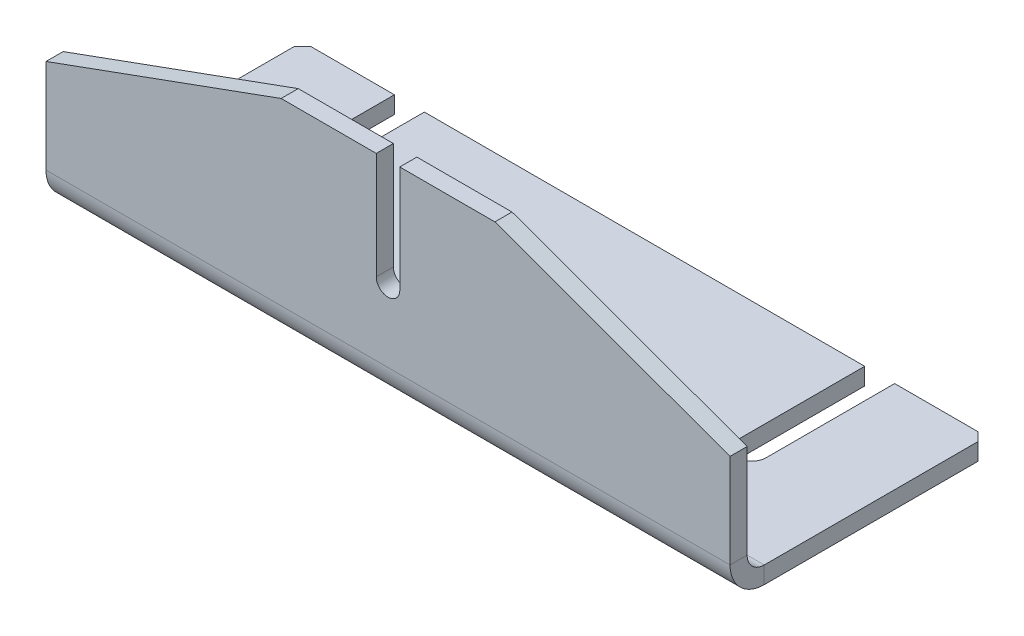
ISO-10303-21;
HEADER;
FILE_DESCRIPTION(('STEP AP214'),'2;1');
FILE_NAME('part.step','',(''),(''),'','','');
FILE_SCHEMA(('AUTOMOTIVE_DESIGN { 1 0 10303 214 1 1 1 1 }'));
ENDSEC;
DATA;
#1=APPLICATION_CONTEXT('core data for automotive mechanical design processes');
#2=APPLICATION_PROTOCOL_DEFINITION('international standard','automotive_design',2000,#1);
#3=PRODUCT_CONTEXT('',#1,'mechanical');
#4=PRODUCT('Part','Part','',(#3));
#5=PRODUCT_RELATED_PRODUCT_CATEGORY('part','',(#4));
#6=PRODUCT_DEFINITION_FORMATION('','',#4);
#7=PRODUCT_DEFINITION_CONTEXT('part definition',#1,'design');
#8=PRODUCT_DEFINITION('design','',#6,#7);
#9=PRODUCT_DEFINITION_SHAPE('','',#8);
#10=(LENGTH_UNIT() NAMED_UNIT(*) SI_UNIT(.MILLI.,.METRE.));
#11=(NAMED_UNIT(*) PLANE_ANGLE_UNIT() SI_UNIT($,.RADIAN.));
#12=(NAMED_UNIT(*) SI_UNIT($,.STERADIAN.) SOLID_ANGLE_UNIT());
#13=UNCERTAINTY_MEASURE_WITH_UNIT(LENGTH_MEASURE(1.E-05),#10,'distance_accuracy_value','');
#14=(GEOMETRIC_REPRESENTATION_CONTEXT(3) GLOBAL_UNCERTAINTY_ASSIGNED_CONTEXT((#13)) GLOBAL_UNIT_ASSIGNED_CONTEXT((#10,
#11,#12)) REPRESENTATION_CONTEXT('',''));
#15=CARTESIAN_POINT('',(0.,0.,0.));
#16=DIRECTION('',(0.,0.,1.));
#17=DIRECTION('',(1.,0.,0.));
#18=AXIS2_PLACEMENT_3D('',#15,#16,#17);
#19=CARTESIAN_POINT('',(80.,0.,0.));
#20=DIRECTION('',(0.,1.,0.));
#21=DIRECTION('',(0.,0.,1.));
#22=AXIS2_PLACEMENT_3D('',#19,#20,#21);
#23=PLANE('',#22);
#24=DIRECTION('',(0.,0.,-1.));
#25=VECTOR('',#24,1.);
#26=CARTESIAN_POINT('',(-80.,0.,0.));
#27=LINE('',#26,#25);
#28=CARTESIAN_POINT('',(-80.,0.,-8.));
#29=VERTEX_POINT('',#28);
#30=CARTESIAN_POINT('',(-80.,0.,-58.));
#31=VERTEX_POINT('',#30);
#32=EDGE_CURVE('E336',#29,#31,#27,.T.);
#33=ORIENTED_EDGE('',*,*,#32,.T.);
#34=DIRECTION('',(-0.707106781186548,0.,0.707106781186548));
#35=VECTOR('',#34,1.);
#36=CARTESIAN_POINT('',(-80.,0.,-58.));
#37=LINE('',#36,#35);
#38=CARTESIAN_POINT('',(-78.,0.,-60.));
#39=VERTEX_POINT('',#38);
#40=EDGE_CURVE('E422',#31,#39,#37,.F.);
#41=ORIENTED_EDGE('',*,*,#40,.T.);
#42=DIRECTION('',(-1.,0.,0.));
#43=VECTOR('',#42,1.);
#44=CARTESIAN_POINT('',(80.,0.,-60.));
#45=LINE('',#44,#43);
#46=CARTESIAN_POINT('',(-58.5,0.,-60.));
#47=VERTEX_POINT('',#46);
#48=EDGE_CURVE('E394',#47,#39,#45,.T.);
#49=ORIENTED_EDGE('',*,*,#48,.F.);
#50=DIRECTION('',(0.,0.,1.));
#51=VECTOR('',#50,1.);
#52=CARTESIAN_POINT('',(-58.5,0.,-90.));
#53=LINE('',#52,#51);
#54=CARTESIAN_POINT('',(-58.5,0.,-30.));
#55=VERTEX_POINT('',#54);
#56=EDGE_CURVE('E272',#47,#55,#53,.T.);
#57=ORIENTED_EDGE('',*,*,#56,.T.);
#58=CARTESIAN_POINT('',(-55.,0.,-30.));
#59=DIRECTION('',(0.,1.,0.));
#60=DIRECTION('',(0.,0.,1.));
#61=AXIS2_PLACEMENT_3D('',#58,#59,#60);
#62=CIRCLE('',#61,3.5);
#63=CARTESIAN_POINT('',(-51.5,0.,-30.));
#64=VERTEX_POINT('',#63);
#65=EDGE_CURVE('E282',#55,#64,#62,.T.);
#66=ORIENTED_EDGE('',*,*,#65,.T.);
#67=DIRECTION('',(0.,0.,1.));
#68=VECTOR('',#67,1.);
#69=CARTESIAN_POINT('',(-51.5,0.,-90.));
#70=LINE('',#69,#68);
#71=CARTESIAN_POINT('',(-51.5,0.,-60.));
#72=VERTEX_POINT('',#71);
#73=EDGE_CURVE('E271',#72,#64,#70,.T.);
#74=ORIENTED_EDGE('',*,*,#73,.F.);
#75=CARTESIAN_POINT('',(51.5,0.,-60.));
#76=VERTEX_POINT('',#75);
#77=EDGE_CURVE('E264',#76,#72,#45,.T.);
#78=ORIENTED_EDGE('',*,*,#77,.F.);
#79=DIRECTION('',(0.,0.,1.));
#80=VECTOR('',#79,1.);
#81=CARTESIAN_POINT('',(51.5,0.,-90.));
#82=LINE('',#81,#80);
#83=CARTESIAN_POINT('',(51.5,0.,-30.));
#84=VERTEX_POINT('',#83);
#85=EDGE_CURVE('E242',#76,#84,#82,.T.);
#86=ORIENTED_EDGE('',*,*,#85,.T.);
#87=CARTESIAN_POINT('',(55.,0.,-30.));
#88=DIRECTION('',(0.,-1.,0.));
#89=DIRECTION('',(0.,0.,-1.));
#90=AXIS2_PLACEMENT_3D('',#87,#88,#89);
#91=CIRCLE('',#90,3.5);
#92=CARTESIAN_POINT('',(58.5,0.,-30.));
#93=VERTEX_POINT('',#92);
#94=EDGE_CURVE('E254',#93,#84,#91,.T.);
#95=ORIENTED_EDGE('',*,*,#94,.F.);
#96=DIRECTION('',(0.,0.,1.));
#97=VECTOR('',#96,1.);
#98=CARTESIAN_POINT('',(58.5,0.,-90.));
#99=LINE('',#98,#97);
#100=CARTESIAN_POINT('',(58.5,0.,-60.));
#101=VERTEX_POINT('',#100);
#102=EDGE_CURVE('E250',#101,#93,#99,.T.);
#103=ORIENTED_EDGE('',*,*,#102,.F.);
#104=CARTESIAN_POINT('',(78.,0.,-60.));
#105=VERTEX_POINT('',#104);
#106=EDGE_CURVE('E396',#105,#101,#45,.T.);
#107=ORIENTED_EDGE('',*,*,#106,.F.);
#108=DIRECTION('',(-0.707106781186543,0.,-0.707106781186552));
#109=VECTOR('',#108,1.);
#110=CARTESIAN_POINT('',(78.,0.,-60.));
#111=LINE('',#110,#109);
#112=CARTESIAN_POINT('',(80.,0.,-58.));
#113=VERTEX_POINT('',#112);
#114=EDGE_CURVE('E420',#105,#113,#111,.F.);
#115=ORIENTED_EDGE('',*,*,#114,.T.);
#116=DIRECTION('',(0.,0.,-1.));
#117=VECTOR('',#116,1.);
#118=CARTESIAN_POINT('',(80.,0.,0.));
#119=LINE('',#118,#117);
#120=CARTESIAN_POINT('',(80.,0.,-8.));
#121=VERTEX_POINT('',#120);
#122=EDGE_CURVE('E343',#121,#113,#119,.T.);
#123=ORIENTED_EDGE('',*,*,#122,.F.);
#124=DIRECTION('',(-1.,0.,0.));
#125=VECTOR('',#124,1.);
#126=CARTESIAN_POINT('',(80.,0.,-8.));
#127=LINE('',#126,#125);
#128=EDGE_CURVE('E358',#121,#29,#127,.T.);
#129=ORIENTED_EDGE('',*,*,#128,.T.);
#130=EDGE_LOOP('',(#33,#41,#49,#57,#66,#74,#78,#86,#95,#103,#107,#115,#123,#129));
#131=FACE_BOUND('',#130,.T.);
#132=ADVANCED_FACE('F77',(#131),#23,.F.);
#133=CARTESIAN_POINT('',(80.,4.,-60.));
#134=DIRECTION('',(0.,0.,-1.));
#135=DIRECTION('',(-1.,0.,0.));
#136=AXIS2_PLACEMENT_3D('',#133,#134,#135);
#137=PLANE('',#136);
#138=DIRECTION('',(-1.,0.,0.));
#139=VECTOR('',#138,1.);
#140=CARTESIAN_POINT('',(80.,4.,-60.));
#141=LINE('',#140,#139);
#142=CARTESIAN_POINT('',(78.,4.,-60.));
#143=VERTEX_POINT('',#142);
#144=CARTESIAN_POINT('',(58.5,4.,-60.));
#145=VERTEX_POINT('',#144);
#146=EDGE_CURVE('E392',#143,#145,#141,.T.);
#147=ORIENTED_EDGE('',*,*,#146,.F.);
#148=DIRECTION('',(0.,-1.,0.));
#149=VECTOR('',#148,1.);
#150=CARTESIAN_POINT('',(78.,4.,-60.));
#151=LINE('',#150,#149);
#152=EDGE_CURVE('E86',#143,#105,#151,.T.);
#153=ORIENTED_EDGE('',*,*,#152,.T.);
#154=ORIENTED_EDGE('',*,*,#106,.T.);
#155=DIRECTION('',(0.,1.,0.));
#156=VECTOR('',#155,1.);
#157=CARTESIAN_POINT('',(58.5,4.,-60.));
#158=LINE('',#157,#156);
#159=EDGE_CURVE('E292',#101,#145,#158,.T.);
#160=ORIENTED_EDGE('',*,*,#159,.T.);
#161=EDGE_LOOP('',(#147,#153,#154,#160));
#162=FACE_BOUND('',#161,.T.);
#163=ADVANCED_FACE('F432',(#162),#137,.T.);
#164=DIRECTION('',(0.,1.,0.));
#165=VECTOR('',#164,1.);
#166=CARTESIAN_POINT('',(51.5,4.,-60.));
#167=LINE('',#166,#165);
#168=CARTESIAN_POINT('',(51.5,4.,-60.));
#169=VERTEX_POINT('',#168);
#170=EDGE_CURVE('E290',#76,#169,#167,.T.);
#171=ORIENTED_EDGE('',*,*,#170,.F.);
#172=ORIENTED_EDGE('',*,*,#77,.T.);
#173=DIRECTION('',(0.,1.,0.));
#174=VECTOR('',#173,1.);
#175=CARTESIAN_POINT('',(-51.5,4.,-60.));
#176=LINE('',#175,#174);
#177=CARTESIAN_POINT('',(-51.5,4.,-60.));
#178=VERTEX_POINT('',#177);
#179=EDGE_CURVE('E268',#72,#178,#176,.T.);
#180=ORIENTED_EDGE('',*,*,#179,.T.);
#181=EDGE_CURVE('E395',#169,#178,#141,.T.);
#182=ORIENTED_EDGE('',*,*,#181,.F.);
#183=EDGE_LOOP('',(#171,#172,#180,#182));
#184=FACE_BOUND('',#183,.T.);
#185=ADVANCED_FACE('F444',(#184),#137,.T.);
#186=CARTESIAN_POINT('',(80.,4.,0.));
#187=DIRECTION('',(0.,1.,0.));
#188=DIRECTION('',(0.,0.,1.));
#189=AXIS2_PLACEMENT_3D('',#186,#187,#188);
#190=PLANE('',#189);
#191=CARTESIAN_POINT('',(-58.5,4.,-60.));
#192=VERTEX_POINT('',#191);
#193=CARTESIAN_POINT('',(-78.,4.,-60.));
#194=VERTEX_POINT('',#193);
#195=EDGE_CURVE('E391',#192,#194,#141,.T.);
#196=ORIENTED_EDGE('',*,*,#195,.T.);
#197=DIRECTION('',(0.707106781186548,0.,-0.707106781186548));
#198=VECTOR('',#197,1.);
#199=CARTESIAN_POINT('',(-29.,4.,-109.));
#200=LINE('',#199,#198);
#201=CARTESIAN_POINT('',(-80.,4.,-58.));
#202=VERTEX_POINT('',#201);
#203=EDGE_CURVE('E427',#194,#202,#200,.F.);
#204=ORIENTED_EDGE('',*,*,#203,.T.);
#205=DIRECTION('',(0.,0.,-1.));
#206=VECTOR('',#205,1.);
#207=CARTESIAN_POINT('',(-80.,4.,0.));
#208=LINE('',#207,#206);
#209=CARTESIAN_POINT('',(-80.,4.,-8.));
#210=VERTEX_POINT('',#209);
#211=EDGE_CURVE('E360',#210,#202,#208,.T.);
#212=ORIENTED_EDGE('',*,*,#211,.F.);
#213=DIRECTION('',(-1.,0.,0.));
#214=VECTOR('',#213,1.);
#215=CARTESIAN_POINT('',(80.,4.,-8.));
#216=LINE('',#215,#214);
#217=CARTESIAN_POINT('',(80.,4.,-8.));
#218=VERTEX_POINT('',#217);
#219=EDGE_CURVE('E388',#218,#210,#216,.T.);
#220=ORIENTED_EDGE('',*,*,#219,.F.);
#221=DIRECTION('',(0.,0.,-1.));
#222=VECTOR('',#221,1.);
#223=CARTESIAN_POINT('',(80.,4.,0.));
#224=LINE('',#223,#222);
#225=CARTESIAN_POINT('',(80.,4.,-58.));
#226=VERTEX_POINT('',#225);
#227=EDGE_CURVE('E345',#218,#226,#224,.T.);
#228=ORIENTED_EDGE('',*,*,#227,.T.);
#229=DIRECTION('',(0.707106781186543,0.,0.707106781186552));
#230=VECTOR('',#229,1.);
#231=CARTESIAN_POINT('',(109.,4.,-28.9999999999996));
#232=LINE('',#231,#230);
#233=EDGE_CURVE('E98',#226,#143,#232,.F.);
#234=ORIENTED_EDGE('',*,*,#233,.T.);
#235=ORIENTED_EDGE('',*,*,#146,.T.);
#236=DIRECTION('',(0.,0.,1.));
#237=VECTOR('',#236,1.);
#238=CARTESIAN_POINT('',(58.5,4.,0.));
#239=LINE('',#238,#237);
#240=CARTESIAN_POINT('',(58.5,4.,-30.));
#241=VERTEX_POINT('',#240);
#242=EDGE_CURVE('E414',#145,#241,#239,.T.);
#243=ORIENTED_EDGE('',*,*,#242,.T.);
#244=CARTESIAN_POINT('',(55.,4.,-30.));
#245=DIRECTION('',(0.,-1.,0.));
#246=DIRECTION('',(0.,0.,-1.));
#247=AXIS2_PLACEMENT_3D('',#244,#245,#246);
#248=CIRCLE('',#247,3.5);
#249=CARTESIAN_POINT('',(51.5,4.,-30.));
#250=VERTEX_POINT('',#249);
#251=EDGE_CURVE('E258',#241,#250,#248,.T.);
#252=ORIENTED_EDGE('',*,*,#251,.T.);
#253=DIRECTION('',(0.,0.,1.));
#254=VECTOR('',#253,1.);
#255=CARTESIAN_POINT('',(51.5,4.,0.));
#256=LINE('',#255,#254);
#257=EDGE_CURVE('E245',#169,#250,#256,.T.);
#258=ORIENTED_EDGE('',*,*,#257,.F.);
#259=ORIENTED_EDGE('',*,*,#181,.T.);
#260=DIRECTION('',(0.,0.,1.));
#261=VECTOR('',#260,1.);
#262=CARTESIAN_POINT('',(-51.5,4.,0.));
#263=LINE('',#262,#261);
#264=CARTESIAN_POINT('',(-51.5,4.,-30.));
#265=VERTEX_POINT('',#264);
#266=EDGE_CURVE('E408',#178,#265,#263,.T.);
#267=ORIENTED_EDGE('',*,*,#266,.T.);
#268=CARTESIAN_POINT('',(-55.,4.,-30.));
#269=DIRECTION('',(0.,1.,0.));
#270=DIRECTION('',(0.,0.,1.));
#271=AXIS2_PLACEMENT_3D('',#268,#269,#270);
#272=CIRCLE('',#271,3.5);
#273=CARTESIAN_POINT('',(-58.5,4.,-30.));
#274=VERTEX_POINT('',#273);
#275=EDGE_CURVE('E275',#274,#265,#272,.T.);
#276=ORIENTED_EDGE('',*,*,#275,.F.);
#277=DIRECTION('',(0.,0.,1.));
#278=VECTOR('',#277,1.);
#279=CARTESIAN_POINT('',(-58.5,4.,0.));
#280=LINE('',#279,#278);
#281=EDGE_CURVE('E411',#192,#274,#280,.T.);
#282=ORIENTED_EDGE('',*,*,#281,.F.);
#283=EDGE_LOOP('',(#196,#204,#212,#220,#228,#234,#235,#243,#252,#258,#259,#267,#276,#282));
#284=FACE_BOUND('',#283,.T.);
#285=ADVANCED_FACE('F440',(#284),#190,.T.);
#286=CARTESIAN_POINT('',(80.,50.,-4.));
#287=DIRECTION('',(0.,0.,-1.));
#288=DIRECTION('',(-1.,0.,0.));
#289=AXIS2_PLACEMENT_3D('',#286,#287,#288);
#290=PLANE('',#289);
#291=DIRECTION('',(0.,1.,0.));
#292=VECTOR('',#291,1.);
#293=CARTESIAN_POINT('',(-80.,50.,-4.));
#294=LINE('',#293,#292);
#295=CARTESIAN_POINT('',(-80.,30.,-4.));
#296=VERTEX_POINT('',#295);
#297=CARTESIAN_POINT('',(-80.,8.,-4.));
#298=VERTEX_POINT('',#297);
#299=EDGE_CURVE('E366',#296,#298,#294,.F.);
#300=ORIENTED_EDGE('',*,*,#299,.F.);
#301=DIRECTION('',(0.939793423488437,0.341743063086705,0.));
#302=VECTOR('',#301,1.);
#303=CARTESIAN_POINT('',(-18.9781021897811,52.1897810218978,-4.));
#304=LINE('',#303,#302);
#305=CARTESIAN_POINT('',(-25.,50.,-4.));
#306=VERTEX_POINT('',#305);
#307=EDGE_CURVE('E295',#296,#306,#304,.T.);
#308=ORIENTED_EDGE('',*,*,#307,.T.);
#309=DIRECTION('',(-1.,0.,0.));
#310=VECTOR('',#309,1.);
#311=CARTESIAN_POINT('',(80.,50.,-4.));
#312=LINE('',#311,#310);
#313=CARTESIAN_POINT('',(-2.75,50.,-4.));
#314=VERTEX_POINT('',#313);
#315=EDGE_CURVE('E381',#314,#306,#312,.T.);
#316=ORIENTED_EDGE('',*,*,#315,.F.);
#317=DIRECTION('',(0.,-1.,0.));
#318=VECTOR('',#317,1.);
#319=CARTESIAN_POINT('',(-2.75000000000001,0.,-4.));
#320=LINE('',#319,#318);
#321=CARTESIAN_POINT('',(-2.75,25.,-4.));
#322=VERTEX_POINT('',#321);
#323=EDGE_CURVE('E320',#314,#322,#320,.T.);
#324=ORIENTED_EDGE('',*,*,#323,.T.);
#325=CARTESIAN_POINT('',(0.,25.,-4.));
#326=DIRECTION('',(0.,0.,-1.));
#327=DIRECTION('',(-1.,0.,0.));
#328=AXIS2_PLACEMENT_3D('',#325,#326,#327);
#329=CIRCLE('',#328,2.75);
#330=CARTESIAN_POINT('',(2.75,25.,-4.));
#331=VERTEX_POINT('',#330);
#332=EDGE_CURVE('E329',#331,#322,#329,.T.);
#333=ORIENTED_EDGE('',*,*,#332,.F.);
#334=DIRECTION('',(0.,-1.,0.));
#335=VECTOR('',#334,1.);
#336=CARTESIAN_POINT('',(2.74999999999999,0.,-4.));
#337=LINE('',#336,#335);
#338=CARTESIAN_POINT('',(2.75,50.,-4.));
#339=VERTEX_POINT('',#338);
#340=EDGE_CURVE('E306',#339,#331,#337,.T.);
#341=ORIENTED_EDGE('',*,*,#340,.F.);
#342=CARTESIAN_POINT('',(25.,50.,-4.));
#343=VERTEX_POINT('',#342);
#344=EDGE_CURVE('E384',#343,#339,#312,.T.);
#345=ORIENTED_EDGE('',*,*,#344,.F.);
#346=DIRECTION('',(-0.939793423488437,0.341743063086704,0.));
#347=VECTOR('',#346,1.);
#348=CARTESIAN_POINT('',(18.978102189781,52.1897810218978,-4.));
#349=LINE('',#348,#347);
#350=CARTESIAN_POINT('',(80.,30.,-4.));
#351=VERTEX_POINT('',#350);
#352=EDGE_CURVE('E300',#351,#343,#349,.T.);
#353=ORIENTED_EDGE('',*,*,#352,.F.);
#354=DIRECTION('',(0.,1.,0.));
#355=VECTOR('',#354,1.);
#356=CARTESIAN_POINT('',(80.,50.,-4.));
#357=LINE('',#356,#355);
#358=CARTESIAN_POINT('',(80.,8.,-4.));
#359=VERTEX_POINT('',#358);
#360=EDGE_CURVE('E351',#351,#359,#357,.F.);
#361=ORIENTED_EDGE('',*,*,#360,.T.);
#362=DIRECTION('',(-1.,0.,0.));
#363=VECTOR('',#362,1.);
#364=CARTESIAN_POINT('',(80.,8.,-4.));
#365=LINE('',#364,#363);
#366=EDGE_CURVE('E385',#359,#298,#365,.T.);
#367=ORIENTED_EDGE('',*,*,#366,.T.);
#368=EDGE_LOOP('',(#300,#308,#316,#324,#333,#341,#345,#353,#361,#367));
#369=FACE_BOUND('',#368,.T.);
#370=ADVANCED_FACE('F491',(#369),#290,.T.);
#371=CARTESIAN_POINT('',(80.,50.,0.));
#372=DIRECTION('',(0.,1.,0.));
#373=DIRECTION('',(0.,0.,1.));
#374=AXIS2_PLACEMENT_3D('',#371,#372,#373);
#375=PLANE('',#374);
#376=ORIENTED_EDGE('',*,*,#315,.T.);
#377=DIRECTION('',(0.,0.,-1.));
#378=VECTOR('',#377,1.);
#379=CARTESIAN_POINT('',(-25.,50.,0.));
#380=LINE('',#379,#378);
#381=CARTESIAN_POINT('',(-25.,50.,0.));
#382=VERTEX_POINT('',#381);
#383=EDGE_CURVE('E302',#382,#306,#380,.T.);
#384=ORIENTED_EDGE('',*,*,#383,.F.);
#385=DIRECTION('',(-1.,0.,0.));
#386=VECTOR('',#385,1.);
#387=CARTESIAN_POINT('',(80.,50.,0.));
#388=LINE('',#387,#386);
#389=CARTESIAN_POINT('',(-2.75,50.,0.));
#390=VERTEX_POINT('',#389);
#391=EDGE_CURVE('E377',#390,#382,#388,.T.);
#392=ORIENTED_EDGE('',*,*,#391,.F.);
#393=DIRECTION('',(0.,0.,-1.));
#394=VECTOR('',#393,1.);
#395=CARTESIAN_POINT('',(-2.75,50.,0.));
#396=LINE('',#395,#394);
#397=EDGE_CURVE('E337',#390,#314,#396,.T.);
#398=ORIENTED_EDGE('',*,*,#397,.T.);
#399=EDGE_LOOP('',(#376,#384,#392,#398));
#400=FACE_BOUND('',#399,.T.);
#401=ADVANCED_FACE('F517',(#400),#375,.T.);
#402=CARTESIAN_POINT('',(80.,50.,0.));
#403=DIRECTION('',(0.,0.,-1.));
#404=DIRECTION('',(-1.,0.,0.));
#405=AXIS2_PLACEMENT_3D('',#402,#403,#404);
#406=PLANE('',#405);
#407=DIRECTION('',(0.939793423488437,0.341743063086705,0.));
#408=VECTOR('',#407,1.);
#409=CARTESIAN_POINT('',(-18.9781021897811,52.1897810218978,0.));
#410=LINE('',#409,#408);
#411=CARTESIAN_POINT('',(-80.,30.,0.));
#412=VERTEX_POINT('',#411);
#413=EDGE_CURVE('E308',#412,#382,#410,.T.);
#414=ORIENTED_EDGE('',*,*,#413,.F.);
#415=DIRECTION('',(0.,-1.,0.));
#416=VECTOR('',#415,1.);
#417=CARTESIAN_POINT('',(-80.,50.,0.));
#418=LINE('',#417,#416);
#419=CARTESIAN_POINT('',(-80.,8.,0.));
#420=VERTEX_POINT('',#419);
#421=EDGE_CURVE('E368',#412,#420,#418,.T.);
#422=ORIENTED_EDGE('',*,*,#421,.T.);
#423=DIRECTION('',(-1.,0.,0.));
#424=VECTOR('',#423,1.);
#425=CARTESIAN_POINT('',(80.,8.,0.));
#426=LINE('',#425,#424);
#427=CARTESIAN_POINT('',(80.,8.,0.));
#428=VERTEX_POINT('',#427);
#429=EDGE_CURVE('E374',#428,#420,#426,.T.);
#430=ORIENTED_EDGE('',*,*,#429,.F.);
#431=DIRECTION('',(0.,-1.,0.));
#432=VECTOR('',#431,1.);
#433=CARTESIAN_POINT('',(80.,50.,0.));
#434=LINE('',#433,#432);
#435=CARTESIAN_POINT('',(80.,30.,0.));
#436=VERTEX_POINT('',#435);
#437=EDGE_CURVE('E353',#436,#428,#434,.T.);
#438=ORIENTED_EDGE('',*,*,#437,.F.);
#439=DIRECTION('',(-0.939793423488437,0.341743063086704,0.));
#440=VECTOR('',#439,1.);
#441=CARTESIAN_POINT('',(18.978102189781,52.1897810218978,0.));
#442=LINE('',#441,#440);
#443=CARTESIAN_POINT('',(25.,50.,0.));
#444=VERTEX_POINT('',#443);
#445=EDGE_CURVE('E296',#436,#444,#442,.T.);
#446=ORIENTED_EDGE('',*,*,#445,.T.);
#447=CARTESIAN_POINT('',(2.75,50.,0.));
#448=VERTEX_POINT('',#447);
#449=EDGE_CURVE('E380',#444,#448,#388,.T.);
#450=ORIENTED_EDGE('',*,*,#449,.T.);
#451=DIRECTION('',(0.,-1.,0.));
#452=VECTOR('',#451,1.);
#453=CARTESIAN_POINT('',(2.74999999999999,0.,0.));
#454=LINE('',#453,#452);
#455=CARTESIAN_POINT('',(2.75,25.,0.));
#456=VERTEX_POINT('',#455);
#457=EDGE_CURVE('E316',#448,#456,#454,.T.);
#458=ORIENTED_EDGE('',*,*,#457,.T.);
#459=CARTESIAN_POINT('',(0.,25.,0.));
#460=DIRECTION('',(0.,0.,-1.));
#461=DIRECTION('',(-1.,0.,0.));
#462=AXIS2_PLACEMENT_3D('',#459,#460,#461);
#463=CIRCLE('',#462,2.75);
#464=CARTESIAN_POINT('',(-2.75,25.,0.));
#465=VERTEX_POINT('',#464);
#466=EDGE_CURVE('E319',#456,#465,#463,.T.);
#467=ORIENTED_EDGE('',*,*,#466,.T.);
#468=DIRECTION('',(0.,-1.,0.));
#469=VECTOR('',#468,1.);
#470=CARTESIAN_POINT('',(-2.75000000000001,0.,0.));
#471=LINE('',#470,#469);
#472=EDGE_CURVE('E323',#390,#465,#471,.T.);
#473=ORIENTED_EDGE('',*,*,#472,.F.);
#474=ORIENTED_EDGE('',*,*,#391,.T.);
#475=EDGE_LOOP('',(#414,#422,#430,#438,#446,#450,#458,#467,#473,#474));
#476=FACE_BOUND('',#475,.T.);
#477=ADVANCED_FACE('F485',(#476),#406,.F.);
#478=CARTESIAN_POINT('',(-80.,8.,-8.));
#479=DIRECTION('',(1.,0.,0.));
#480=DIRECTION('',(0.,0.,-1.));
#481=AXIS2_PLACEMENT_3D('',#478,#479,#480);
#482=PLANE('',#481);
#483=DIRECTION('',(0.,0.,-1.));
#484=VECTOR('',#483,1.);
#485=CARTESIAN_POINT('',(-80.,30.,0.));
#486=LINE('',#485,#484);
#487=EDGE_CURVE('E310',#412,#296,#486,.T.);
#488=ORIENTED_EDGE('',*,*,#487,.T.);
#489=ORIENTED_EDGE('',*,*,#299,.T.);
#490=DIRECTION('',(0.,0.,1.));
#491=VECTOR('',#490,1.);
#492=CARTESIAN_POINT('',(-80.,8.,-4.));
#493=LINE('',#492,#491);
#494=EDGE_CURVE('E398',#298,#420,#493,.T.);
#495=ORIENTED_EDGE('',*,*,#494,.T.);
#496=ORIENTED_EDGE('',*,*,#421,.F.);
#497=EDGE_LOOP('',(#488,#489,#495,#496));
#498=FACE_BOUND('',#497,.T.);
#499=ADVANCED_FACE('F488',(#498),#482,.F.);
#500=CARTESIAN_POINT('',(80.,8.,0.));
#501=DIRECTION('',(1.,0.,0.));
#502=DIRECTION('',(0.,0.,-1.));
#503=AXIS2_PLACEMENT_3D('',#500,#501,#502);
#504=PLANE('',#503);
#505=DIRECTION('',(0.,0.,-1.));
#506=VECTOR('',#505,1.);
#507=CARTESIAN_POINT('',(80.,8.,0.));
#508=LINE('',#507,#506);
#509=EDGE_CURVE('E405',#428,#359,#508,.T.);
#510=ORIENTED_EDGE('',*,*,#509,.F.);
#511=CARTESIAN_POINT('',(80.,8.,-8.));
#512=DIRECTION('',(-1.,0.,0.));
#513=DIRECTION('',(0.,0.,1.));
#514=AXIS2_PLACEMENT_3D('',#511,#512,#513);
#515=CIRCLE('',#514,8.);
#516=EDGE_CURVE('E355',#428,#121,#515,.F.);
#517=ORIENTED_EDGE('',*,*,#516,.T.);
#518=DIRECTION('',(0.,-1.,0.));
#519=VECTOR('',#518,1.);
#520=CARTESIAN_POINT('',(80.,4.,-8.));
#521=LINE('',#520,#519);
#522=EDGE_CURVE('E403',#218,#121,#521,.T.);
#523=ORIENTED_EDGE('',*,*,#522,.F.);
#524=CARTESIAN_POINT('',(80.,8.,-8.));
#525=DIRECTION('',(1.,0.,0.));
#526=DIRECTION('',(0.,0.,-1.));
#527=AXIS2_PLACEMENT_3D('',#524,#525,#526);
#528=CIRCLE('',#527,4.);
#529=EDGE_CURVE('E348',#359,#218,#528,.T.);
#530=ORIENTED_EDGE('',*,*,#529,.F.);
#531=EDGE_LOOP('',(#510,#517,#523,#530));
#532=FACE_BOUND('',#531,.T.);
#533=ADVANCED_FACE('F479',(#532),#504,.T.);
#534=CARTESIAN_POINT('',(80.,4.,-8.));
#535=DIRECTION('',(1.,0.,0.));
#536=DIRECTION('',(0.,0.,-1.));
#537=AXIS2_PLACEMENT_3D('',#534,#535,#536);
#538=PLANE('',#537);
#539=DIRECTION('',(0.,0.,-1.));
#540=VECTOR('',#539,1.);
#541=CARTESIAN_POINT('',(80.,30.,0.));
#542=LINE('',#541,#540);
#543=EDGE_CURVE('E299',#436,#351,#542,.T.);
#544=ORIENTED_EDGE('',*,*,#543,.F.);
#545=ORIENTED_EDGE('',*,*,#437,.T.);
#546=ORIENTED_EDGE('',*,*,#509,.T.);
#547=ORIENTED_EDGE('',*,*,#360,.F.);
#548=EDGE_LOOP('',(#544,#545,#546,#547));
#549=FACE_BOUND('',#548,.T.);
#550=ADVANCED_FACE('F496',(#549),#538,.T.);
#551=CARTESIAN_POINT('',(-80.,0.,-8.));
#552=DIRECTION('',(-1.,0.,0.));
#553=DIRECTION('',(0.,0.,1.));
#554=AXIS2_PLACEMENT_3D('',#551,#552,#553);
#555=PLANE('',#554);
#556=DIRECTION('',(0.,1.,0.));
#557=VECTOR('',#556,1.);
#558=CARTESIAN_POINT('',(-80.,0.,-8.));
#559=LINE('',#558,#557);
#560=EDGE_CURVE('E401',#29,#210,#559,.T.);
#561=ORIENTED_EDGE('',*,*,#560,.F.);
#562=CARTESIAN_POINT('',(-80.,8.,-8.));
#563=DIRECTION('',(-1.,0.,0.));
#564=DIRECTION('',(0.,0.,1.));
#565=AXIS2_PLACEMENT_3D('',#562,#563,#564);
#566=CIRCLE('',#565,8.);
#567=EDGE_CURVE('E346',#420,#29,#566,.F.);
#568=ORIENTED_EDGE('',*,*,#567,.F.);
#569=ORIENTED_EDGE('',*,*,#494,.F.);
#570=CARTESIAN_POINT('',(-80.,8.,-8.));
#571=DIRECTION('',(1.,0.,0.));
#572=DIRECTION('',(0.,0.,-1.));
#573=AXIS2_PLACEMENT_3D('',#570,#571,#572);
#574=CIRCLE('',#573,4.);
#575=EDGE_CURVE('E363',#298,#210,#574,.T.);
#576=ORIENTED_EDGE('',*,*,#575,.T.);
#577=EDGE_LOOP('',(#561,#568,#569,#576));
#578=FACE_BOUND('',#577,.T.);
#579=ADVANCED_FACE('F469',(#578),#555,.T.);
#580=CARTESIAN_POINT('',(-80.,8.,-4.));
#581=DIRECTION('',(-1.,0.,0.));
#582=DIRECTION('',(0.,0.,1.));
#583=AXIS2_PLACEMENT_3D('',#580,#581,#582);
#584=PLANE('',#583);
#585=ORIENTED_EDGE('',*,*,#211,.T.);
#586=DIRECTION('',(0.,-1.,0.));
#587=VECTOR('',#586,1.);
#588=CARTESIAN_POINT('',(-80.,8.,-58.));
#589=LINE('',#588,#587);
#590=EDGE_CURVE('E417',#202,#31,#589,.T.);
#591=ORIENTED_EDGE('',*,*,#590,.T.);
#592=ORIENTED_EDGE('',*,*,#32,.F.);
#593=ORIENTED_EDGE('',*,*,#560,.T.);
#594=EDGE_LOOP('',(#585,#591,#592,#593));
#595=FACE_BOUND('',#594,.T.);
#596=ADVANCED_FACE('F458',(#595),#584,.T.);
#597=ORIENTED_EDGE('',*,*,#48,.T.);
#598=DIRECTION('',(0.,1.,0.));
#599=VECTOR('',#598,1.);
#600=CARTESIAN_POINT('',(-78.,4.,-60.));
#601=LINE('',#600,#599);
#602=EDGE_CURVE('E424',#39,#194,#601,.T.);
#603=ORIENTED_EDGE('',*,*,#602,.T.);
#604=ORIENTED_EDGE('',*,*,#195,.F.);
#605=DIRECTION('',(0.,1.,0.));
#606=VECTOR('',#605,1.);
#607=CARTESIAN_POINT('',(-58.5,4.,-60.));
#608=LINE('',#607,#606);
#609=EDGE_CURVE('E288',#47,#192,#608,.T.);
#610=ORIENTED_EDGE('',*,*,#609,.F.);
#611=EDGE_LOOP('',(#597,#603,#604,#610));
#612=FACE_BOUND('',#611,.T.);
#613=ADVANCED_FACE('F539',(#612),#137,.T.);
#614=CARTESIAN_POINT('',(80.,8.,-8.));
#615=DIRECTION('',(-1.,0.,0.));
#616=DIRECTION('',(0.,0.,1.));
#617=AXIS2_PLACEMENT_3D('',#614,#615,#616);
#618=CYLINDRICAL_SURFACE('',#617,4.);
#619=ORIENTED_EDGE('',*,*,#575,.F.);
#620=ORIENTED_EDGE('',*,*,#366,.F.);
#621=ORIENTED_EDGE('',*,*,#529,.T.);
#622=ORIENTED_EDGE('',*,*,#219,.T.);
#623=EDGE_LOOP('',(#619,#620,#621,#622));
#624=FACE_BOUND('',#623,.T.);
#625=ADVANCED_FACE('F473',(#624),#618,.F.);
#626=DIRECTION('',(0.,0.,-1.));
#627=VECTOR('',#626,1.);
#628=CARTESIAN_POINT('',(25.,50.,0.));
#629=LINE('',#628,#627);
#630=EDGE_CURVE('E303',#444,#343,#629,.T.);
#631=ORIENTED_EDGE('',*,*,#630,.T.);
#632=ORIENTED_EDGE('',*,*,#344,.T.);
#633=DIRECTION('',(0.,0.,-1.));
#634=VECTOR('',#633,1.);
#635=CARTESIAN_POINT('',(2.75,50.,0.));
#636=LINE('',#635,#634);
#637=EDGE_CURVE('E334',#448,#339,#636,.T.);
#638=ORIENTED_EDGE('',*,*,#637,.F.);
#639=ORIENTED_EDGE('',*,*,#449,.F.);
#640=EDGE_LOOP('',(#631,#632,#638,#639));
#641=FACE_BOUND('',#640,.T.);
#642=ADVANCED_FACE('F503',(#641),#375,.T.);
#643=CARTESIAN_POINT('',(80.,8.,-8.));
#644=DIRECTION('',(-1.,0.,0.));
#645=DIRECTION('',(0.,0.,1.));
#646=AXIS2_PLACEMENT_3D('',#643,#644,#645);
#647=CYLINDRICAL_SURFACE('',#646,8.);
#648=ORIENTED_EDGE('',*,*,#567,.T.);
#649=ORIENTED_EDGE('',*,*,#128,.F.);
#650=ORIENTED_EDGE('',*,*,#516,.F.);
#651=ORIENTED_EDGE('',*,*,#429,.T.);
#652=EDGE_LOOP('',(#648,#649,#650,#651));
#653=FACE_BOUND('',#652,.T.);
#654=ADVANCED_FACE('F464',(#653),#647,.T.);
#655=CARTESIAN_POINT('',(80.,8.,-8.));
#656=DIRECTION('',(1.,0.,0.));
#657=DIRECTION('',(0.,0.,-1.));
#658=AXIS2_PLACEMENT_3D('',#655,#656,#657);
#659=PLANE('',#658);
#660=ORIENTED_EDGE('',*,*,#122,.T.);
#661=DIRECTION('',(0.,1.,0.));
#662=VECTOR('',#661,1.);
#663=CARTESIAN_POINT('',(80.,8.,-58.));
#664=LINE('',#663,#662);
#665=EDGE_CURVE('E12',#113,#226,#664,.T.);
#666=ORIENTED_EDGE('',*,*,#665,.T.);
#667=ORIENTED_EDGE('',*,*,#227,.F.);
#668=ORIENTED_EDGE('',*,*,#522,.T.);
#669=EDGE_LOOP('',(#660,#666,#667,#668));
#670=FACE_BOUND('',#669,.T.);
#671=ADVANCED_FACE('F476',(#670),#659,.T.);
#672=CARTESIAN_POINT('',(-18.9781021897811,52.1897810218978,0.));
#673=DIRECTION('',(-0.341743063086705,0.939793423488437,0.));
#674=DIRECTION('',(-0.939793423488437,-0.341743063086705,0.));
#675=AXIS2_PLACEMENT_3D('',#672,#673,#674);
#676=PLANE('',#675);
#677=ORIENTED_EDGE('',*,*,#307,.F.);
#678=ORIENTED_EDGE('',*,*,#487,.F.);
#679=ORIENTED_EDGE('',*,*,#413,.T.);
#680=ORIENTED_EDGE('',*,*,#383,.T.);
#681=EDGE_LOOP('',(#677,#678,#679,#680));
#682=FACE_BOUND('',#681,.T.);
#683=ADVANCED_FACE('F519',(#682),#676,.T.);
#684=CARTESIAN_POINT('',(2.74999999999999,0.,0.));
#685=DIRECTION('',(1.,0.,0.));
#686=DIRECTION('',(0.,1.,0.));
#687=AXIS2_PLACEMENT_3D('',#684,#685,#686);
#688=PLANE('',#687);
#689=ORIENTED_EDGE('',*,*,#340,.T.);
#690=DIRECTION('',(0.,0.,-1.));
#691=VECTOR('',#690,1.);
#692=CARTESIAN_POINT('',(2.75,25.,0.));
#693=LINE('',#692,#691);
#694=EDGE_CURVE('E326',#456,#331,#693,.T.);
#695=ORIENTED_EDGE('',*,*,#694,.F.);
#696=ORIENTED_EDGE('',*,*,#457,.F.);
#697=ORIENTED_EDGE('',*,*,#637,.T.);
#698=EDGE_LOOP('',(#689,#695,#696,#697));
#699=FACE_BOUND('',#698,.T.);
#700=ADVANCED_FACE('F507',(#699),#688,.F.);
#701=CARTESIAN_POINT('',(-2.75000000000001,0.,0.));
#702=DIRECTION('',(1.,0.,0.));
#703=DIRECTION('',(0.,1.,0.));
#704=AXIS2_PLACEMENT_3D('',#701,#702,#703);
#705=PLANE('',#704);
#706=ORIENTED_EDGE('',*,*,#323,.F.);
#707=ORIENTED_EDGE('',*,*,#397,.F.);
#708=ORIENTED_EDGE('',*,*,#472,.T.);
#709=DIRECTION('',(0.,0.,-1.));
#710=VECTOR('',#709,1.);
#711=CARTESIAN_POINT('',(-2.75,25.,0.));
#712=LINE('',#711,#710);
#713=EDGE_CURVE('E340',#465,#322,#712,.T.);
#714=ORIENTED_EDGE('',*,*,#713,.T.);
#715=EDGE_LOOP('',(#706,#707,#708,#714));
#716=FACE_BOUND('',#715,.T.);
#717=ADVANCED_FACE('F526',(#716),#705,.T.);
#718=CARTESIAN_POINT('',(0.,25.,0.));
#719=DIRECTION('',(0.,0.,-1.));
#720=DIRECTION('',(-1.,0.,0.));
#721=AXIS2_PLACEMENT_3D('',#718,#719,#720);
#722=CYLINDRICAL_SURFACE('',#721,2.75);
#723=ORIENTED_EDGE('',*,*,#332,.T.);
#724=ORIENTED_EDGE('',*,*,#713,.F.);
#725=ORIENTED_EDGE('',*,*,#466,.F.);
#726=ORIENTED_EDGE('',*,*,#694,.T.);
#727=EDGE_LOOP('',(#723,#724,#725,#726));
#728=FACE_BOUND('',#727,.T.);
#729=ADVANCED_FACE('F510',(#728),#722,.F.);
#730=CARTESIAN_POINT('',(18.978102189781,52.1897810218978,0.));
#731=DIRECTION('',(-0.341743063086704,-0.939793423488437,0.));
#732=DIRECTION('',(0.939793423488437,-0.341743063086704,0.));
#733=AXIS2_PLACEMENT_3D('',#730,#731,#732);
#734=PLANE('',#733);
#735=ORIENTED_EDGE('',*,*,#352,.T.);
#736=ORIENTED_EDGE('',*,*,#630,.F.);
#737=ORIENTED_EDGE('',*,*,#445,.F.);
#738=ORIENTED_EDGE('',*,*,#543,.T.);
#739=EDGE_LOOP('',(#735,#736,#737,#738));
#740=FACE_BOUND('',#739,.T.);
#741=ADVANCED_FACE('F498',(#740),#734,.F.);
#742=CARTESIAN_POINT('',(-55.,0.,-30.));
#743=DIRECTION('',(0.,1.,0.));
#744=DIRECTION('',(0.,0.,1.));
#745=AXIS2_PLACEMENT_3D('',#742,#743,#744);
#746=CYLINDRICAL_SURFACE('',#745,3.5);
#747=DIRECTION('',(0.,1.,0.));
#748=VECTOR('',#747,1.);
#749=CARTESIAN_POINT('',(-51.5,0.,-30.));
#750=LINE('',#749,#748);
#751=EDGE_CURVE('E277',#265,#64,#750,.F.);
#752=ORIENTED_EDGE('',*,*,#751,.T.);
#753=ORIENTED_EDGE('',*,*,#65,.F.);
#754=DIRECTION('',(0.,1.,0.));
#755=VECTOR('',#754,1.);
#756=CARTESIAN_POINT('',(-58.5,0.,-30.));
#757=LINE('',#756,#755);
#758=EDGE_CURVE('E280',#274,#55,#757,.F.);
#759=ORIENTED_EDGE('',*,*,#758,.F.);
#760=ORIENTED_EDGE('',*,*,#275,.T.);
#761=EDGE_LOOP('',(#752,#753,#759,#760));
#762=FACE_BOUND('',#761,.T.);
#763=ADVANCED_FACE('F568',(#762),#746,.F.);
#764=CARTESIAN_POINT('',(-58.5,0.,-90.));
#765=DIRECTION('',(-1.,0.,0.));
#766=DIRECTION('',(0.,0.,1.));
#767=AXIS2_PLACEMENT_3D('',#764,#765,#766);
#768=PLANE('',#767);
#769=ORIENTED_EDGE('',*,*,#609,.T.);
#770=ORIENTED_EDGE('',*,*,#281,.T.);
#771=ORIENTED_EDGE('',*,*,#758,.T.);
#772=ORIENTED_EDGE('',*,*,#56,.F.);
#773=EDGE_LOOP('',(#769,#770,#771,#772));
#774=FACE_BOUND('',#773,.T.);
#775=ADVANCED_FACE('F566',(#774),#768,.F.);
#776=CARTESIAN_POINT('',(-51.5,0.,-90.));
#777=DIRECTION('',(-1.,0.,0.));
#778=DIRECTION('',(0.,0.,1.));
#779=AXIS2_PLACEMENT_3D('',#776,#777,#778);
#780=PLANE('',#779);
#781=ORIENTED_EDGE('',*,*,#73,.T.);
#782=ORIENTED_EDGE('',*,*,#751,.F.);
#783=ORIENTED_EDGE('',*,*,#266,.F.);
#784=ORIENTED_EDGE('',*,*,#179,.F.);
#785=EDGE_LOOP('',(#781,#782,#783,#784));
#786=FACE_BOUND('',#785,.T.);
#787=ADVANCED_FACE('F563',(#786),#780,.T.);
#788=CARTESIAN_POINT('',(58.5,0.,-90.));
#789=DIRECTION('',(-1.,0.,0.));
#790=DIRECTION('',(0.,0.,1.));
#791=AXIS2_PLACEMENT_3D('',#788,#789,#790);
#792=PLANE('',#791);
#793=ORIENTED_EDGE('',*,*,#102,.T.);
#794=DIRECTION('',(0.,1.,0.));
#795=VECTOR('',#794,1.);
#796=CARTESIAN_POINT('',(58.5,0.,-30.));
#797=LINE('',#796,#795);
#798=EDGE_CURVE('E249',#93,#241,#797,.T.);
#799=ORIENTED_EDGE('',*,*,#798,.T.);
#800=ORIENTED_EDGE('',*,*,#242,.F.);
#801=ORIENTED_EDGE('',*,*,#159,.F.);
#802=EDGE_LOOP('',(#793,#799,#800,#801));
#803=FACE_BOUND('',#802,.T.);
#804=ADVANCED_FACE('F437',(#803),#792,.T.);
#805=CARTESIAN_POINT('',(51.5,0.,-90.));
#806=DIRECTION('',(-1.,0.,0.));
#807=DIRECTION('',(0.,0.,1.));
#808=AXIS2_PLACEMENT_3D('',#805,#806,#807);
#809=PLANE('',#808);
#810=ORIENTED_EDGE('',*,*,#170,.T.);
#811=ORIENTED_EDGE('',*,*,#257,.T.);
#812=DIRECTION('',(0.,1.,0.));
#813=VECTOR('',#812,1.);
#814=CARTESIAN_POINT('',(51.5,0.,-30.));
#815=LINE('',#814,#813);
#816=EDGE_CURVE('E238',#84,#250,#815,.T.);
#817=ORIENTED_EDGE('',*,*,#816,.F.);
#818=ORIENTED_EDGE('',*,*,#85,.F.);
#819=EDGE_LOOP('',(#810,#811,#817,#818));
#820=FACE_BOUND('',#819,.T.);
#821=ADVANCED_FACE('F240',(#820),#809,.F.);
#822=CARTESIAN_POINT('',(55.,0.,-30.));
#823=DIRECTION('',(0.,1.,0.));
#824=DIRECTION('',(0.,0.,1.));
#825=AXIS2_PLACEMENT_3D('',#822,#823,#824);
#826=CYLINDRICAL_SURFACE('',#825,3.5);
#827=ORIENTED_EDGE('',*,*,#94,.T.);
#828=ORIENTED_EDGE('',*,*,#816,.T.);
#829=ORIENTED_EDGE('',*,*,#251,.F.);
#830=ORIENTED_EDGE('',*,*,#798,.F.);
#831=EDGE_LOOP('',(#827,#828,#829,#830));
#832=FACE_BOUND('',#831,.T.);
#833=ADVANCED_FACE('F255',(#832),#826,.F.);
#834=CARTESIAN_POINT('',(-80.,8.,-58.));
#835=DIRECTION('',(0.707106781186547,0.,0.707106781186547));
#836=DIRECTION('',(0.,-1.,0.));
#837=AXIS2_PLACEMENT_3D('',#834,#835,#836);
#838=PLANE('',#837);
#839=ORIENTED_EDGE('',*,*,#203,.F.);
#840=ORIENTED_EDGE('',*,*,#602,.F.);
#841=ORIENTED_EDGE('',*,*,#40,.F.);
#842=ORIENTED_EDGE('',*,*,#590,.F.);
#843=EDGE_LOOP('',(#839,#840,#841,#842));
#844=FACE_BOUND('',#843,.T.);
#845=ADVANCED_FACE('F455',(#844),#838,.F.);
#846=CARTESIAN_POINT('',(78.,4.,-60.));
#847=DIRECTION('',(-0.707106781186552,0.,0.707106781186543));
#848=DIRECTION('',(0.,-1.,0.));
#849=AXIS2_PLACEMENT_3D('',#846,#847,#848);
#850=PLANE('',#849);
#851=ORIENTED_EDGE('',*,*,#233,.F.);
#852=ORIENTED_EDGE('',*,*,#665,.F.);
#853=ORIENTED_EDGE('',*,*,#114,.F.);
#854=ORIENTED_EDGE('',*,*,#152,.F.);
#855=EDGE_LOOP('',(#851,#852,#853,#854));
#856=FACE_BOUND('',#855,.T.);
#857=ADVANCED_FACE('F80',(#856),#850,.F.);
#858=CLOSED_SHELL('',(#132,#163,#185,#285,#370,#401,#477,#499,#533,#550,#579,#596,#613,#625,
#642,#654,#671,#683,#700,#717,#729,#741,#763,#775,#787,#804,#821,#833,#845,#857));
#859=MANIFOLD_SOLID_BREP('B2',#858);
#860=ADVANCED_BREP_SHAPE_REPRESENTATION('',(#18,#859),#14);
#861=SHAPE_DEFINITION_REPRESENTATION(#9,#860);
ENDSEC;
END-ISO-10303-21;
